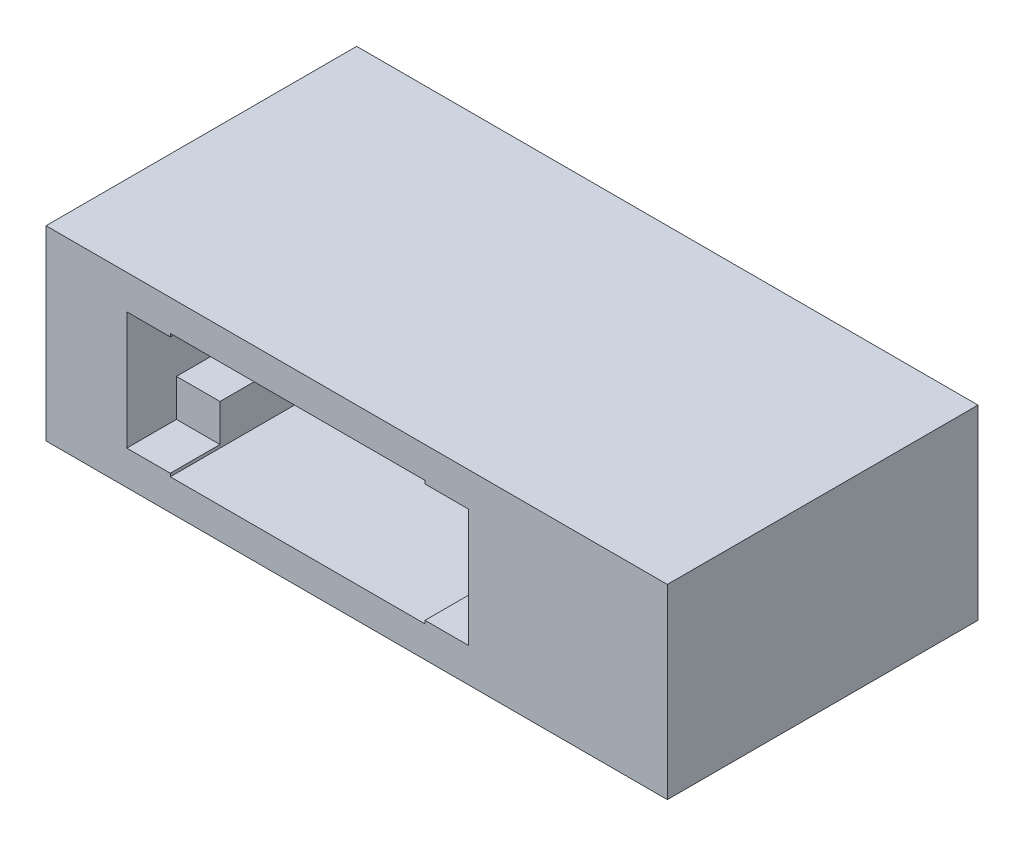
ISO-10303-21;
HEADER;
FILE_DESCRIPTION(('STEP AP214'),'2;1');
FILE_NAME('part.step','',(''),(''),'','','');
FILE_SCHEMA(('AUTOMOTIVE_DESIGN { 1 0 10303 214 1 1 1 1 }'));
ENDSEC;
DATA;
#1=APPLICATION_CONTEXT('core data for automotive mechanical design processes');
#2=APPLICATION_PROTOCOL_DEFINITION('international standard','automotive_design',2000,#1);
#3=PRODUCT_CONTEXT('',#1,'mechanical');
#4=PRODUCT('Part','Part','',(#3));
#5=PRODUCT_RELATED_PRODUCT_CATEGORY('part','',(#4));
#6=PRODUCT_DEFINITION_FORMATION('','',#4);
#7=PRODUCT_DEFINITION_CONTEXT('part definition',#1,'design');
#8=PRODUCT_DEFINITION('design','',#6,#7);
#9=PRODUCT_DEFINITION_SHAPE('','',#8);
#10=(LENGTH_UNIT() NAMED_UNIT(*) SI_UNIT(.MILLI.,.METRE.));
#11=(NAMED_UNIT(*) PLANE_ANGLE_UNIT() SI_UNIT($,.RADIAN.));
#12=(NAMED_UNIT(*) SI_UNIT($,.STERADIAN.) SOLID_ANGLE_UNIT());
#13=UNCERTAINTY_MEASURE_WITH_UNIT(LENGTH_MEASURE(1.E-05),#10,'distance_accuracy_value','');
#14=(GEOMETRIC_REPRESENTATION_CONTEXT(3) GLOBAL_UNCERTAINTY_ASSIGNED_CONTEXT((#13)) GLOBAL_UNIT_ASSIGNED_CONTEXT((#10,
#11,#12)) REPRESENTATION_CONTEXT('',''));
#15=CARTESIAN_POINT('',(0.,0.,0.));
#16=DIRECTION('',(0.,0.,1.));
#17=DIRECTION('',(1.,0.,0.));
#18=AXIS2_PLACEMENT_3D('',#15,#16,#17);
#19=CARTESIAN_POINT('',(0.,0.,13.));
#20=DIRECTION('',(0.,0.,-1.));
#21=DIRECTION('',(-1.,0.,0.));
#22=AXIS2_PLACEMENT_3D('',#19,#20,#21);
#23=PLANE('',#22);
#24=DIRECTION('',(1.,0.,0.));
#25=VECTOR('',#24,1.);
#26=CARTESIAN_POINT('',(-23.9699208264724,0.395348837209302,13.));
#27=LINE('',#26,#25);
#28=CARTESIAN_POINT('',(-16.9699208264724,0.395348837209302,13.));
#29=VERTEX_POINT('',#28);
#30=CARTESIAN_POINT('',(24.0300791735276,0.395348837209302,13.));
#31=VERTEX_POINT('',#30);
#32=EDGE_CURVE('E11',#29,#31,#27,.T.);
#33=ORIENTED_EDGE('',*,*,#32,.F.);
#34=DIRECTION('',(0.,-1.,0.));
#35=VECTOR('',#34,1.);
#36=CARTESIAN_POINT('',(-16.9699208264724,13.8953488372093,13.));
#37=LINE('',#36,#35);
#38=CARTESIAN_POINT('',(-16.9699208264724,-6.1046511627907,13.));
#39=VERTEX_POINT('',#38);
#40=EDGE_CURVE('E322',#29,#39,#37,.T.);
#41=ORIENTED_EDGE('',*,*,#40,.T.);
#42=DIRECTION('',(1.,0.,0.));
#43=VECTOR('',#42,1.);
#44=CARTESIAN_POINT('',(-16.9699208264724,-6.1046511627907,13.));
#45=LINE('',#44,#43);
#46=CARTESIAN_POINT('',(24.0300791735276,-6.1046511627907,13.));
#47=VERTEX_POINT('',#46);
#48=EDGE_CURVE('E314',#39,#47,#45,.T.);
#49=ORIENTED_EDGE('',*,*,#48,.T.);
#50=DIRECTION('',(0.,-1.,0.));
#51=VECTOR('',#50,1.);
#52=CARTESIAN_POINT('',(24.0300791735276,13.8953488372093,13.));
#53=LINE('',#52,#51);
#54=EDGE_CURVE('E317',#31,#47,#53,.T.);
#55=ORIENTED_EDGE('',*,*,#54,.F.);
#56=EDGE_LOOP('',(#33,#41,#49,#55));
#57=FACE_BOUND('',#56,.T.);
#58=ADVANCED_FACE('F38',(#57),#23,.F.);
#59=DIRECTION('',(-1.,0.,0.));
#60=VECTOR('',#59,1.);
#61=CARTESIAN_POINT('',(-23.9699208264724,7.3953488372093,13.));
#62=LINE('',#61,#60);
#63=CARTESIAN_POINT('',(24.0300791735276,7.3953488372093,13.));
#64=VERTEX_POINT('',#63);
#65=CARTESIAN_POINT('',(-16.9699208264724,7.3953488372093,13.));
#66=VERTEX_POINT('',#65);
#67=EDGE_CURVE('E219',#64,#66,#62,.T.);
#68=ORIENTED_EDGE('',*,*,#67,.F.);
#69=CARTESIAN_POINT('',(24.0300791735276,13.8953488372093,13.));
#70=VERTEX_POINT('',#69);
#71=EDGE_CURVE('E208',#70,#64,#53,.T.);
#72=ORIENTED_EDGE('',*,*,#71,.F.);
#73=DIRECTION('',(1.,0.,0.));
#74=VECTOR('',#73,1.);
#75=CARTESIAN_POINT('',(-16.9699208264724,13.8953488372093,13.));
#76=LINE('',#75,#74);
#77=CARTESIAN_POINT('',(-16.9699208264724,13.8953488372093,13.));
#78=VERTEX_POINT('',#77);
#79=EDGE_CURVE('E320',#78,#70,#76,.T.);
#80=ORIENTED_EDGE('',*,*,#79,.F.);
#81=EDGE_CURVE('E323',#78,#66,#37,.T.);
#82=ORIENTED_EDGE('',*,*,#81,.T.);
#83=EDGE_LOOP('',(#68,#72,#80,#82));
#84=FACE_BOUND('',#83,.T.);
#85=ADVANCED_FACE('F408',(#84),#23,.F.);
#86=CARTESIAN_POINT('',(-16.9699208264724,13.8953488372093,13.));
#87=DIRECTION('',(-1.,0.,0.));
#88=DIRECTION('',(0.,-1.,0.));
#89=AXIS2_PLACEMENT_3D('',#86,#87,#88);
#90=PLANE('',#89);
#91=ORIENTED_EDGE('',*,*,#40,.F.);
#92=DIRECTION('',(0.,0.,1.));
#93=VECTOR('',#92,1.);
#94=CARTESIAN_POINT('',(-16.9699208264724,0.395348837209302,13.));
#95=LINE('',#94,#93);
#96=CARTESIAN_POINT('',(-16.9699208264724,0.395348837209302,42.));
#97=VERTEX_POINT('',#96);
#98=EDGE_CURVE('E248',#29,#97,#95,.T.);
#99=ORIENTED_EDGE('',*,*,#98,.T.);
#100=DIRECTION('',(0.,1.,0.));
#101=VECTOR('',#100,1.);
#102=CARTESIAN_POINT('',(-16.9699208264724,13.3953488372093,42.));
#103=LINE('',#102,#101);
#104=CARTESIAN_POINT('',(-16.9699208264724,-5.6046511627907,42.));
#105=VERTEX_POINT('',#104);
#106=EDGE_CURVE('E286',#105,#97,#103,.T.);
#107=ORIENTED_EDGE('',*,*,#106,.F.);
#108=DIRECTION('',(0.,0.,1.));
#109=VECTOR('',#108,1.);
#110=CARTESIAN_POINT('',(-16.9699208264724,-5.6046511627907,42.));
#111=LINE('',#110,#109);
#112=CARTESIAN_POINT('',(-16.9699208264724,-5.6046511627907,50.));
#113=VERTEX_POINT('',#112);
#114=EDGE_CURVE('E274',#105,#113,#111,.T.);
#115=ORIENTED_EDGE('',*,*,#114,.T.);
#116=DIRECTION('',(0.,-1.,0.));
#117=VECTOR('',#116,1.);
#118=CARTESIAN_POINT('',(-16.9699208264724,13.8953488372093,50.));
#119=LINE('',#118,#117);
#120=CARTESIAN_POINT('',(-16.9699208264724,-6.1046511627907,50.));
#121=VERTEX_POINT('',#120);
#122=EDGE_CURVE('E336',#113,#121,#119,.T.);
#123=ORIENTED_EDGE('',*,*,#122,.T.);
#124=DIRECTION('',(0.,0.,1.));
#125=VECTOR('',#124,1.);
#126=CARTESIAN_POINT('',(-16.9699208264724,-6.1046511627907,13.));
#127=LINE('',#126,#125);
#128=EDGE_CURVE('E339',#39,#121,#127,.T.);
#129=ORIENTED_EDGE('',*,*,#128,.F.);
#130=EDGE_LOOP('',(#91,#99,#107,#115,#123,#129));
#131=FACE_BOUND('',#130,.T.);
#132=ADVANCED_FACE('F415',(#131),#90,.F.);
#133=CARTESIAN_POINT('',(0.,0.,42.));
#134=DIRECTION('',(0.,0.,-1.));
#135=DIRECTION('',(-1.,0.,0.));
#136=AXIS2_PLACEMENT_3D('',#133,#134,#135);
#137=PLANE('',#136);
#138=ORIENTED_EDGE('',*,*,#106,.T.);
#139=DIRECTION('',(1.,0.,0.));
#140=VECTOR('',#139,1.);
#141=CARTESIAN_POINT('',(-16.9699208264724,0.395348837209302,42.));
#142=LINE('',#141,#140);
#143=CARTESIAN_POINT('',(-23.9699208264724,0.395348837209302,42.));
#144=VERTEX_POINT('',#143);
#145=EDGE_CURVE('E245',#144,#97,#142,.T.);
#146=ORIENTED_EDGE('',*,*,#145,.F.);
#147=DIRECTION('',(0.,-1.,0.));
#148=VECTOR('',#147,1.);
#149=CARTESIAN_POINT('',(-23.9699208264724,13.3953488372093,42.));
#150=LINE('',#149,#148);
#151=CARTESIAN_POINT('',(-23.9699208264724,-5.6046511627907,42.));
#152=VERTEX_POINT('',#151);
#153=EDGE_CURVE('E293',#144,#152,#150,.T.);
#154=ORIENTED_EDGE('',*,*,#153,.T.);
#155=DIRECTION('',(1.,0.,0.));
#156=VECTOR('',#155,1.);
#157=CARTESIAN_POINT('',(-16.9699208264724,-5.6046511627907,42.));
#158=LINE('',#157,#156);
#159=EDGE_CURVE('E297',#152,#105,#158,.T.);
#160=ORIENTED_EDGE('',*,*,#159,.T.);
#161=EDGE_LOOP('',(#138,#146,#154,#160));
#162=FACE_BOUND('',#161,.T.);
#163=ADVANCED_FACE('F504',(#162),#137,.F.);
#164=CARTESIAN_POINT('',(-36.9699208264724,-11.1046511627907,50.));
#165=DIRECTION('',(0.,1.,0.));
#166=DIRECTION('',(0.,0.,1.));
#167=AXIS2_PLACEMENT_3D('',#164,#165,#166);
#168=PLANE('',#167);
#169=DIRECTION('',(1.,0.,0.));
#170=VECTOR('',#169,1.);
#171=CARTESIAN_POINT('',(-36.9699208264724,-11.1046511627907,0.));
#172=LINE('',#171,#170);
#173=CARTESIAN_POINT('',(-36.9699208264724,-11.1046511627907,0.));
#174=VERTEX_POINT('',#173);
#175=CARTESIAN_POINT('',(63.0300791735277,-11.1046511627907,0.));
#176=VERTEX_POINT('',#175);
#177=EDGE_CURVE('E342',#174,#176,#172,.T.);
#178=ORIENTED_EDGE('',*,*,#177,.T.);
#179=DIRECTION('',(0.,0.,-1.));
#180=VECTOR('',#179,1.);
#181=CARTESIAN_POINT('',(63.0300791735277,-11.1046511627907,50.));
#182=LINE('',#181,#180);
#183=CARTESIAN_POINT('',(63.0300791735277,-11.1046511627907,50.));
#184=VERTEX_POINT('',#183);
#185=EDGE_CURVE('E42',#184,#176,#182,.T.);
#186=ORIENTED_EDGE('',*,*,#185,.F.);
#187=DIRECTION('',(1.,0.,0.));
#188=VECTOR('',#187,1.);
#189=CARTESIAN_POINT('',(-36.9699208264724,-11.1046511627907,50.));
#190=LINE('',#189,#188);
#191=CARTESIAN_POINT('',(-36.9699208264724,-11.1046511627907,50.));
#192=VERTEX_POINT('',#191);
#193=EDGE_CURVE('E349',#192,#184,#190,.T.);
#194=ORIENTED_EDGE('',*,*,#193,.F.);
#195=DIRECTION('',(0.,0.,-1.));
#196=VECTOR('',#195,1.);
#197=CARTESIAN_POINT('',(-36.9699208264724,-11.1046511627907,50.));
#198=LINE('',#197,#196);
#199=EDGE_CURVE('E360',#192,#174,#198,.T.);
#200=ORIENTED_EDGE('',*,*,#199,.T.);
#201=EDGE_LOOP('',(#178,#186,#194,#200));
#202=FACE_BOUND('',#201,.T.);
#203=ADVANCED_FACE('F40',(#202),#168,.F.);
#204=CARTESIAN_POINT('',(63.0300791735276,18.8953488372093,50.));
#205=DIRECTION('',(1.,0.,0.));
#206=DIRECTION('',(0.,1.,0.));
#207=AXIS2_PLACEMENT_3D('',#204,#205,#206);
#208=PLANE('',#207);
#209=DIRECTION('',(0.,-1.,0.));
#210=VECTOR('',#209,1.);
#211=CARTESIAN_POINT('',(63.0300791735276,18.8953488372093,0.));
#212=LINE('',#211,#210);
#213=CARTESIAN_POINT('',(63.0300791735276,18.8953488372093,0.));
#214=VERTEX_POINT('',#213);
#215=EDGE_CURVE('E363',#214,#176,#212,.T.);
#216=ORIENTED_EDGE('',*,*,#215,.F.);
#217=DIRECTION('',(0.,0.,-1.));
#218=VECTOR('',#217,1.);
#219=CARTESIAN_POINT('',(63.0300791735276,18.8953488372093,50.));
#220=LINE('',#219,#218);
#221=CARTESIAN_POINT('',(63.0300791735276,18.8953488372093,50.));
#222=VERTEX_POINT('',#221);
#223=EDGE_CURVE('E373',#222,#214,#220,.T.);
#224=ORIENTED_EDGE('',*,*,#223,.F.);
#225=DIRECTION('',(0.,-1.,0.));
#226=VECTOR('',#225,1.);
#227=CARTESIAN_POINT('',(63.0300791735276,18.8953488372093,50.));
#228=LINE('',#227,#226);
#229=EDGE_CURVE('E351',#222,#184,#228,.T.);
#230=ORIENTED_EDGE('',*,*,#229,.T.);
#231=ORIENTED_EDGE('',*,*,#185,.T.);
#232=EDGE_LOOP('',(#216,#224,#230,#231));
#233=FACE_BOUND('',#232,.T.);
#234=ADVANCED_FACE('F379',(#233),#208,.T.);
#235=CARTESIAN_POINT('',(-36.9699208264724,18.8953488372093,50.));
#236=DIRECTION('',(0.,1.,0.));
#237=DIRECTION('',(0.,0.,1.));
#238=AXIS2_PLACEMENT_3D('',#235,#236,#237);
#239=PLANE('',#238);
#240=DIRECTION('',(1.,0.,0.));
#241=VECTOR('',#240,1.);
#242=CARTESIAN_POINT('',(-36.9699208264724,18.8953488372093,0.));
#243=LINE('',#242,#241);
#244=CARTESIAN_POINT('',(-36.9699208264724,18.8953488372093,0.));
#245=VERTEX_POINT('',#244);
#246=EDGE_CURVE('E366',#245,#214,#243,.T.);
#247=ORIENTED_EDGE('',*,*,#246,.F.);
#248=DIRECTION('',(0.,0.,-1.));
#249=VECTOR('',#248,1.);
#250=CARTESIAN_POINT('',(-36.9699208264724,18.8953488372093,50.));
#251=LINE('',#250,#249);
#252=CARTESIAN_POINT('',(-36.9699208264724,18.8953488372093,50.));
#253=VERTEX_POINT('',#252);
#254=EDGE_CURVE('E372',#253,#245,#251,.T.);
#255=ORIENTED_EDGE('',*,*,#254,.F.);
#256=DIRECTION('',(1.,0.,0.));
#257=VECTOR('',#256,1.);
#258=CARTESIAN_POINT('',(-36.9699208264724,18.8953488372093,50.));
#259=LINE('',#258,#257);
#260=EDGE_CURVE('E355',#253,#222,#259,.T.);
#261=ORIENTED_EDGE('',*,*,#260,.T.);
#262=ORIENTED_EDGE('',*,*,#223,.T.);
#263=EDGE_LOOP('',(#247,#255,#261,#262));
#264=FACE_BOUND('',#263,.T.);
#265=ADVANCED_FACE('F386',(#264),#239,.T.);
#266=CARTESIAN_POINT('',(-36.9699208264724,18.8953488372093,50.));
#267=DIRECTION('',(1.,0.,0.));
#268=DIRECTION('',(0.,0.,-1.));
#269=AXIS2_PLACEMENT_3D('',#266,#267,#268);
#270=PLANE('',#269);
#271=DIRECTION('',(0.,-1.,0.));
#272=VECTOR('',#271,1.);
#273=CARTESIAN_POINT('',(-36.9699208264724,18.8953488372093,0.));
#274=LINE('',#273,#272);
#275=EDGE_CURVE('E352',#245,#174,#274,.T.);
#276=ORIENTED_EDGE('',*,*,#275,.T.);
#277=ORIENTED_EDGE('',*,*,#199,.F.);
#278=DIRECTION('',(0.,-1.,0.));
#279=VECTOR('',#278,1.);
#280=CARTESIAN_POINT('',(-36.9699208264724,18.8953488372093,50.));
#281=LINE('',#280,#279);
#282=EDGE_CURVE('E358',#253,#192,#281,.T.);
#283=ORIENTED_EDGE('',*,*,#282,.F.);
#284=ORIENTED_EDGE('',*,*,#254,.T.);
#285=EDGE_LOOP('',(#276,#277,#283,#284));
#286=FACE_BOUND('',#285,.T.);
#287=ADVANCED_FACE('F390',(#286),#270,.F.);
#288=CARTESIAN_POINT('',(0.,0.,50.));
#289=DIRECTION('',(0.,0.,-1.));
#290=DIRECTION('',(-1.,0.,0.));
#291=AXIS2_PLACEMENT_3D('',#288,#289,#290);
#292=PLANE('',#291);
#293=DIRECTION('',(0.,-1.,0.));
#294=VECTOR('',#293,1.);
#295=CARTESIAN_POINT('',(24.0300791735276,13.8953488372093,50.));
#296=LINE('',#295,#294);
#297=CARTESIAN_POINT('',(24.0300791735276,13.8953488372093,50.));
#298=VERTEX_POINT('',#297);
#299=CARTESIAN_POINT('',(24.0300791735276,13.3953488372093,50.));
#300=VERTEX_POINT('',#299);
#301=EDGE_CURVE('E330',#298,#300,#296,.T.);
#302=ORIENTED_EDGE('',*,*,#301,.T.);
#303=DIRECTION('',(-1.,0.,0.));
#304=VECTOR('',#303,1.);
#305=CARTESIAN_POINT('',(24.0300791735276,13.3953488372093,50.));
#306=LINE('',#305,#304);
#307=CARTESIAN_POINT('',(31.0300791735276,13.3953488372093,50.));
#308=VERTEX_POINT('',#307);
#309=EDGE_CURVE('E261',#308,#300,#306,.T.);
#310=ORIENTED_EDGE('',*,*,#309,.F.);
#311=DIRECTION('',(0.,1.,0.));
#312=VECTOR('',#311,1.);
#313=CARTESIAN_POINT('',(31.0300791735276,13.3953488372093,50.));
#314=LINE('',#313,#312);
#315=CARTESIAN_POINT('',(31.0300791735276,-5.6046511627907,50.));
#316=VERTEX_POINT('',#315);
#317=EDGE_CURVE('E273',#316,#308,#314,.T.);
#318=ORIENTED_EDGE('',*,*,#317,.F.);
#319=DIRECTION('',(1.,0.,0.));
#320=VECTOR('',#319,1.);
#321=CARTESIAN_POINT('',(24.0300791735276,-5.6046511627907,50.));
#322=LINE('',#321,#320);
#323=CARTESIAN_POINT('',(24.0300791735276,-5.6046511627907,50.));
#324=VERTEX_POINT('',#323);
#325=EDGE_CURVE('E270',#324,#316,#322,.T.);
#326=ORIENTED_EDGE('',*,*,#325,.F.);
#327=CARTESIAN_POINT('',(24.0300791735276,-6.1046511627907,50.));
#328=VERTEX_POINT('',#327);
#329=EDGE_CURVE('E329',#324,#328,#296,.T.);
#330=ORIENTED_EDGE('',*,*,#329,.T.);
#331=DIRECTION('',(1.,0.,0.));
#332=VECTOR('',#331,1.);
#333=CARTESIAN_POINT('',(-16.9699208264724,-6.1046511627907,50.));
#334=LINE('',#333,#332);
#335=EDGE_CURVE('E280',#121,#328,#334,.T.);
#336=ORIENTED_EDGE('',*,*,#335,.F.);
#337=ORIENTED_EDGE('',*,*,#122,.F.);
#338=DIRECTION('',(1.,0.,0.));
#339=VECTOR('',#338,1.);
#340=CARTESIAN_POINT('',(-16.9699208264724,-5.6046511627907,50.));
#341=LINE('',#340,#339);
#342=CARTESIAN_POINT('',(-23.9699208264724,-5.6046511627907,50.));
#343=VERTEX_POINT('',#342);
#344=EDGE_CURVE('E305',#343,#113,#341,.T.);
#345=ORIENTED_EDGE('',*,*,#344,.F.);
#346=DIRECTION('',(0.,-1.,0.));
#347=VECTOR('',#346,1.);
#348=CARTESIAN_POINT('',(-23.9699208264724,13.3953488372093,50.));
#349=LINE('',#348,#347);
#350=CARTESIAN_POINT('',(-23.9699208264724,13.3953488372093,50.));
#351=VERTEX_POINT('',#350);
#352=EDGE_CURVE('E302',#351,#343,#349,.T.);
#353=ORIENTED_EDGE('',*,*,#352,.F.);
#354=DIRECTION('',(-1.,0.,0.));
#355=VECTOR('',#354,1.);
#356=CARTESIAN_POINT('',(-16.9699208264724,13.3953488372093,50.));
#357=LINE('',#356,#355);
#358=CARTESIAN_POINT('',(-16.9699208264724,13.3953488372093,50.));
#359=VERTEX_POINT('',#358);
#360=EDGE_CURVE('E251',#359,#351,#357,.T.);
#361=ORIENTED_EDGE('',*,*,#360,.F.);
#362=CARTESIAN_POINT('',(-16.9699208264724,13.8953488372093,50.));
#363=VERTEX_POINT('',#362);
#364=EDGE_CURVE('E318',#363,#359,#119,.T.);
#365=ORIENTED_EDGE('',*,*,#364,.F.);
#366=DIRECTION('',(1.,0.,0.));
#367=VECTOR('',#366,1.);
#368=CARTESIAN_POINT('',(-16.9699208264724,13.8953488372093,50.));
#369=LINE('',#368,#367);
#370=EDGE_CURVE('E333',#363,#298,#369,.T.);
#371=ORIENTED_EDGE('',*,*,#370,.T.);
#372=EDGE_LOOP('',(#302,#310,#318,#326,#330,#336,#337,#345,#353,#361,#365,#371));
#373=FACE_BOUND('',#372,.T.);
#374=ORIENTED_EDGE('',*,*,#193,.T.);
#375=ORIENTED_EDGE('',*,*,#229,.F.);
#376=ORIENTED_EDGE('',*,*,#260,.F.);
#377=ORIENTED_EDGE('',*,*,#282,.T.);
#378=EDGE_LOOP('',(#374,#375,#376,#377));
#379=FACE_BOUND('',#378,.T.);
#380=ADVANCED_FACE('F392',(#373,#379),#292,.F.);
#381=CARTESIAN_POINT('',(0.,0.,0.));
#382=DIRECTION('',(0.,0.,-1.));
#383=DIRECTION('',(-1.,0.,0.));
#384=AXIS2_PLACEMENT_3D('',#381,#382,#383);
#385=PLANE('',#384);
#386=CARTESIAN_POINT('',(-7.96992082647236,3.8953488372093,0.));
#387=DIRECTION('',(0.,0.,-1.));
#388=DIRECTION('',(-1.,0.,0.));
#389=AXIS2_PLACEMENT_3D('',#386,#387,#388);
#390=CIRCLE('',#389,2.5);
#391=CARTESIAN_POINT('',(-10.4699208264724,3.8953488372093,0.));
#392=VERTEX_POINT('',#391);
#393=EDGE_CURVE('E595',#392,#392,#390,.T.);
#394=ORIENTED_EDGE('',*,*,#393,.F.);
#395=EDGE_LOOP('',(#394));
#396=FACE_BOUND('',#395,.T.);
#397=DIRECTION('',(0.,1.,0.));
#398=VECTOR('',#397,1.);
#399=CARTESIAN_POINT('',(24.0300791735276,7.3953488372093,0.));
#400=LINE('',#399,#398);
#401=CARTESIAN_POINT('',(24.0300791735276,0.395348837209302,0.));
#402=VERTEX_POINT('',#401);
#403=CARTESIAN_POINT('',(24.0300791735276,7.3953488372093,0.));
#404=VERTEX_POINT('',#403);
#405=EDGE_CURVE('E204',#402,#404,#400,.T.);
#406=ORIENTED_EDGE('',*,*,#405,.T.);
#407=DIRECTION('',(-1.,0.,0.));
#408=VECTOR('',#407,1.);
#409=CARTESIAN_POINT('',(24.0300791735276,7.3953488372093,0.));
#410=LINE('',#409,#408);
#411=CARTESIAN_POINT('',(19.0300791735276,7.3953488372093,0.));
#412=VERTEX_POINT('',#411);
#413=EDGE_CURVE('E214',#404,#412,#410,.T.);
#414=ORIENTED_EDGE('',*,*,#413,.T.);
#415=DIRECTION('',(0.,-1.,0.));
#416=VECTOR('',#415,1.);
#417=CARTESIAN_POINT('',(19.0300791735276,7.3953488372093,0.));
#418=LINE('',#417,#416);
#419=CARTESIAN_POINT('',(19.0300791735276,0.395348837209302,0.));
#420=VERTEX_POINT('',#419);
#421=EDGE_CURVE('E228',#412,#420,#418,.T.);
#422=ORIENTED_EDGE('',*,*,#421,.T.);
#423=DIRECTION('',(1.,0.,0.));
#424=VECTOR('',#423,1.);
#425=CARTESIAN_POINT('',(24.0300791735276,0.395348837209302,0.));
#426=LINE('',#425,#424);
#427=EDGE_CURVE('E224',#420,#402,#426,.T.);
#428=ORIENTED_EDGE('',*,*,#427,.T.);
#429=EDGE_LOOP('',(#406,#414,#422,#428));
#430=FACE_BOUND('',#429,.T.);
#431=ORIENTED_EDGE('',*,*,#177,.F.);
#432=ORIENTED_EDGE('',*,*,#275,.F.);
#433=ORIENTED_EDGE('',*,*,#246,.T.);
#434=ORIENTED_EDGE('',*,*,#215,.T.);
#435=EDGE_LOOP('',(#431,#432,#433,#434));
#436=FACE_BOUND('',#435,.T.);
#437=ADVANCED_FACE('F222',(#396,#430,#436),#385,.T.);
#438=CARTESIAN_POINT('',(-16.9699208264724,-6.1046511627907,13.));
#439=DIRECTION('',(0.,-1.,0.));
#440=DIRECTION('',(1.,0.,0.));
#441=AXIS2_PLACEMENT_3D('',#438,#439,#440);
#442=PLANE('',#441);
#443=ORIENTED_EDGE('',*,*,#335,.T.);
#444=DIRECTION('',(0.,0.,1.));
#445=VECTOR('',#444,1.);
#446=CARTESIAN_POINT('',(24.0300791735276,-6.1046511627907,13.));
#447=LINE('',#446,#445);
#448=EDGE_CURVE('E326',#47,#328,#447,.T.);
#449=ORIENTED_EDGE('',*,*,#448,.F.);
#450=ORIENTED_EDGE('',*,*,#48,.F.);
#451=ORIENTED_EDGE('',*,*,#128,.T.);
#452=EDGE_LOOP('',(#443,#449,#450,#451));
#453=FACE_BOUND('',#452,.T.);
#454=ADVANCED_FACE('F401',(#453),#442,.F.);
#455=CARTESIAN_POINT('',(-16.9699208264724,7.3953488372093,42.));
#456=VERTEX_POINT('',#455);
#457=CARTESIAN_POINT('',(-16.9699208264724,13.3953488372093,42.));
#458=VERTEX_POINT('',#457);
#459=EDGE_CURVE('E290',#456,#458,#103,.T.);
#460=ORIENTED_EDGE('',*,*,#459,.F.);
#461=DIRECTION('',(0.,0.,1.));
#462=VECTOR('',#461,1.);
#463=CARTESIAN_POINT('',(-16.9699208264724,7.3953488372093,13.));
#464=LINE('',#463,#462);
#465=EDGE_CURVE('E247',#66,#456,#464,.T.);
#466=ORIENTED_EDGE('',*,*,#465,.F.);
#467=ORIENTED_EDGE('',*,*,#81,.F.);
#468=DIRECTION('',(0.,0.,1.));
#469=VECTOR('',#468,1.);
#470=CARTESIAN_POINT('',(-16.9699208264724,13.8953488372093,13.));
#471=LINE('',#470,#469);
#472=EDGE_CURVE('E343',#78,#363,#471,.T.);
#473=ORIENTED_EDGE('',*,*,#472,.T.);
#474=ORIENTED_EDGE('',*,*,#364,.T.);
#475=DIRECTION('',(0.,0.,1.));
#476=VECTOR('',#475,1.);
#477=CARTESIAN_POINT('',(-16.9699208264724,13.3953488372093,42.));
#478=LINE('',#477,#476);
#479=EDGE_CURVE('E299',#458,#359,#478,.T.);
#480=ORIENTED_EDGE('',*,*,#479,.F.);
#481=EDGE_LOOP('',(#460,#466,#467,#473,#474,#480));
#482=FACE_BOUND('',#481,.T.);
#483=ADVANCED_FACE('F421',(#482),#90,.F.);
#484=CARTESIAN_POINT('',(-16.9699208264724,13.8953488372093,13.));
#485=DIRECTION('',(0.,-1.,0.));
#486=DIRECTION('',(1.,0.,0.));
#487=AXIS2_PLACEMENT_3D('',#484,#485,#486);
#488=PLANE('',#487);
#489=ORIENTED_EDGE('',*,*,#370,.F.);
#490=ORIENTED_EDGE('',*,*,#472,.F.);
#491=ORIENTED_EDGE('',*,*,#79,.T.);
#492=DIRECTION('',(0.,0.,1.));
#493=VECTOR('',#492,1.);
#494=CARTESIAN_POINT('',(24.0300791735276,13.8953488372093,13.));
#495=LINE('',#494,#493);
#496=EDGE_CURVE('E345',#70,#298,#495,.T.);
#497=ORIENTED_EDGE('',*,*,#496,.T.);
#498=EDGE_LOOP('',(#489,#490,#491,#497));
#499=FACE_BOUND('',#498,.T.);
#500=ADVANCED_FACE('F424',(#499),#488,.T.);
#501=CARTESIAN_POINT('',(24.0300791735276,13.8953488372093,13.));
#502=DIRECTION('',(-1.,0.,0.));
#503=DIRECTION('',(0.,0.,1.));
#504=AXIS2_PLACEMENT_3D('',#501,#502,#503);
#505=PLANE('',#504);
#506=DIRECTION('',(0.,0.,1.));
#507=VECTOR('',#506,1.);
#508=CARTESIAN_POINT('',(24.0300791735276,13.3953488372093,42.));
#509=LINE('',#508,#507);
#510=CARTESIAN_POINT('',(24.0300791735276,13.3953488372093,42.));
#511=VERTEX_POINT('',#510);
#512=EDGE_CURVE('E278',#511,#300,#509,.T.);
#513=ORIENTED_EDGE('',*,*,#512,.T.);
#514=ORIENTED_EDGE('',*,*,#301,.F.);
#515=ORIENTED_EDGE('',*,*,#496,.F.);
#516=ORIENTED_EDGE('',*,*,#71,.T.);
#517=DIRECTION('',(0.,0.,1.));
#518=VECTOR('',#517,1.);
#519=CARTESIAN_POINT('',(24.0300791735276,7.3953488372093,8.));
#520=LINE('',#519,#518);
#521=EDGE_CURVE('E199',#404,#64,#520,.T.);
#522=ORIENTED_EDGE('',*,*,#521,.F.);
#523=ORIENTED_EDGE('',*,*,#405,.F.);
#524=DIRECTION('',(0.,0.,1.));
#525=VECTOR('',#524,1.);
#526=CARTESIAN_POINT('',(24.0300791735276,0.395348837209302,8.));
#527=LINE('',#526,#525);
#528=EDGE_CURVE('E211',#402,#31,#527,.T.);
#529=ORIENTED_EDGE('',*,*,#528,.T.);
#530=ORIENTED_EDGE('',*,*,#54,.T.);
#531=ORIENTED_EDGE('',*,*,#448,.T.);
#532=ORIENTED_EDGE('',*,*,#329,.F.);
#533=DIRECTION('',(0.,0.,1.));
#534=VECTOR('',#533,1.);
#535=CARTESIAN_POINT('',(24.0300791735276,-5.6046511627907,42.));
#536=LINE('',#535,#534);
#537=CARTESIAN_POINT('',(24.0300791735276,-5.6046511627907,42.));
#538=VERTEX_POINT('',#537);
#539=EDGE_CURVE('E269',#538,#324,#536,.T.);
#540=ORIENTED_EDGE('',*,*,#539,.F.);
#541=DIRECTION('',(0.,-1.,0.));
#542=VECTOR('',#541,1.);
#543=CARTESIAN_POINT('',(24.0300791735276,13.3953488372093,42.));
#544=LINE('',#543,#542);
#545=EDGE_CURVE('E257',#511,#538,#544,.T.);
#546=ORIENTED_EDGE('',*,*,#545,.F.);
#547=EDGE_LOOP('',(#513,#514,#515,#516,#522,#523,#529,#530,#531,#532,#540,#546));
#548=FACE_BOUND('',#547,.T.);
#549=ADVANCED_FACE('F201',(#548),#505,.T.);
#550=CARTESIAN_POINT('',(24.0300791735276,13.3953488372093,42.));
#551=DIRECTION('',(0.,1.,0.));
#552=DIRECTION('',(-1.,0.,0.));
#553=AXIS2_PLACEMENT_3D('',#550,#551,#552);
#554=PLANE('',#553);
#555=ORIENTED_EDGE('',*,*,#309,.T.);
#556=ORIENTED_EDGE('',*,*,#512,.F.);
#557=DIRECTION('',(-1.,0.,0.));
#558=VECTOR('',#557,1.);
#559=CARTESIAN_POINT('',(24.0300791735276,13.3953488372093,42.));
#560=LINE('',#559,#558);
#561=CARTESIAN_POINT('',(31.0300791735276,13.3953488372093,42.));
#562=VERTEX_POINT('',#561);
#563=EDGE_CURVE('E267',#562,#511,#560,.T.);
#564=ORIENTED_EDGE('',*,*,#563,.F.);
#565=DIRECTION('',(0.,0.,1.));
#566=VECTOR('',#565,1.);
#567=CARTESIAN_POINT('',(31.0300791735276,13.3953488372093,42.));
#568=LINE('',#567,#566);
#569=EDGE_CURVE('E281',#562,#308,#568,.T.);
#570=ORIENTED_EDGE('',*,*,#569,.T.);
#571=EDGE_LOOP('',(#555,#556,#564,#570));
#572=FACE_BOUND('',#571,.T.);
#573=ADVANCED_FACE('F430',(#572),#554,.F.);
#574=CARTESIAN_POINT('',(31.0300791735276,13.3953488372093,42.));
#575=DIRECTION('',(1.,0.,0.));
#576=DIRECTION('',(0.,1.,0.));
#577=AXIS2_PLACEMENT_3D('',#574,#575,#576);
#578=PLANE('',#577);
#579=ORIENTED_EDGE('',*,*,#317,.T.);
#580=ORIENTED_EDGE('',*,*,#569,.F.);
#581=DIRECTION('',(0.,1.,0.));
#582=VECTOR('',#581,1.);
#583=CARTESIAN_POINT('',(31.0300791735276,13.3953488372093,42.));
#584=LINE('',#583,#582);
#585=CARTESIAN_POINT('',(31.0300791735276,-5.6046511627907,42.));
#586=VERTEX_POINT('',#585);
#587=EDGE_CURVE('E264',#586,#562,#584,.T.);
#588=ORIENTED_EDGE('',*,*,#587,.F.);
#589=DIRECTION('',(0.,0.,1.));
#590=VECTOR('',#589,1.);
#591=CARTESIAN_POINT('',(31.0300791735276,-5.6046511627907,42.));
#592=LINE('',#591,#590);
#593=EDGE_CURVE('E283',#586,#316,#592,.T.);
#594=ORIENTED_EDGE('',*,*,#593,.T.);
#595=EDGE_LOOP('',(#579,#580,#588,#594));
#596=FACE_BOUND('',#595,.T.);
#597=ADVANCED_FACE('F479',(#596),#578,.F.);
#598=CARTESIAN_POINT('',(24.0300791735276,-5.6046511627907,42.));
#599=DIRECTION('',(0.,-1.,0.));
#600=DIRECTION('',(1.,0.,0.));
#601=AXIS2_PLACEMENT_3D('',#598,#599,#600);
#602=PLANE('',#601);
#603=ORIENTED_EDGE('',*,*,#325,.T.);
#604=ORIENTED_EDGE('',*,*,#593,.F.);
#605=DIRECTION('',(1.,0.,0.));
#606=VECTOR('',#605,1.);
#607=CARTESIAN_POINT('',(24.0300791735276,-5.6046511627907,42.));
#608=LINE('',#607,#606);
#609=EDGE_CURVE('E260',#538,#586,#608,.T.);
#610=ORIENTED_EDGE('',*,*,#609,.F.);
#611=ORIENTED_EDGE('',*,*,#539,.T.);
#612=EDGE_LOOP('',(#603,#604,#610,#611));
#613=FACE_BOUND('',#612,.T.);
#614=ADVANCED_FACE('F482',(#613),#602,.F.);
#615=CARTESIAN_POINT('',(0.,0.,42.));
#616=DIRECTION('',(0.,0.,1.));
#617=DIRECTION('',(1.,0.,0.));
#618=AXIS2_PLACEMENT_3D('',#615,#616,#617);
#619=PLANE('',#618);
#620=ORIENTED_EDGE('',*,*,#545,.T.);
#621=ORIENTED_EDGE('',*,*,#609,.T.);
#622=ORIENTED_EDGE('',*,*,#587,.T.);
#623=ORIENTED_EDGE('',*,*,#563,.T.);
#624=EDGE_LOOP('',(#620,#621,#622,#623));
#625=FACE_BOUND('',#624,.T.);
#626=ADVANCED_FACE('F484',(#625),#619,.T.);
#627=CARTESIAN_POINT('',(-16.9699208264724,-5.6046511627907,42.));
#628=DIRECTION('',(0.,-1.,0.));
#629=DIRECTION('',(1.,0.,0.));
#630=AXIS2_PLACEMENT_3D('',#627,#628,#629);
#631=PLANE('',#630);
#632=ORIENTED_EDGE('',*,*,#344,.T.);
#633=ORIENTED_EDGE('',*,*,#114,.F.);
#634=ORIENTED_EDGE('',*,*,#159,.F.);
#635=DIRECTION('',(0.,0.,1.));
#636=VECTOR('',#635,1.);
#637=CARTESIAN_POINT('',(-23.9699208264724,-5.6046511627907,42.));
#638=LINE('',#637,#636);
#639=EDGE_CURVE('E309',#152,#343,#638,.T.);
#640=ORIENTED_EDGE('',*,*,#639,.T.);
#641=EDGE_LOOP('',(#632,#633,#634,#640));
#642=FACE_BOUND('',#641,.T.);
#643=ADVANCED_FACE('F454',(#642),#631,.F.);
#644=CARTESIAN_POINT('',(-23.9699208264724,13.3953488372093,42.));
#645=DIRECTION('',(-1.,0.,0.));
#646=DIRECTION('',(0.,-1.,0.));
#647=AXIS2_PLACEMENT_3D('',#644,#645,#646);
#648=PLANE('',#647);
#649=ORIENTED_EDGE('',*,*,#352,.T.);
#650=ORIENTED_EDGE('',*,*,#639,.F.);
#651=ORIENTED_EDGE('',*,*,#153,.F.);
#652=DIRECTION('',(0.,0.,1.));
#653=VECTOR('',#652,1.);
#654=CARTESIAN_POINT('',(-23.9699208264724,0.395348837209302,13.));
#655=LINE('',#654,#653);
#656=CARTESIAN_POINT('',(-23.9699208264724,0.395348837209302,8.));
#657=VERTEX_POINT('',#656);
#658=EDGE_CURVE('E252',#657,#144,#655,.T.);
#659=ORIENTED_EDGE('',*,*,#658,.F.);
#660=DIRECTION('',(0.,-1.,0.));
#661=VECTOR('',#660,1.);
#662=CARTESIAN_POINT('',(-23.9699208264724,7.3953488372093,8.));
#663=LINE('',#662,#661);
#664=CARTESIAN_POINT('',(-23.9699208264724,7.3953488372093,8.));
#665=VERTEX_POINT('',#664);
#666=EDGE_CURVE('E234',#665,#657,#663,.T.);
#667=ORIENTED_EDGE('',*,*,#666,.F.);
#668=DIRECTION('',(0.,0.,1.));
#669=VECTOR('',#668,1.);
#670=CARTESIAN_POINT('',(-23.9699208264724,7.3953488372093,13.));
#671=LINE('',#670,#669);
#672=CARTESIAN_POINT('',(-23.9699208264724,7.3953488372093,42.));
#673=VERTEX_POINT('',#672);
#674=EDGE_CURVE('E254',#665,#673,#671,.T.);
#675=ORIENTED_EDGE('',*,*,#674,.T.);
#676=CARTESIAN_POINT('',(-23.9699208264724,13.3953488372093,42.));
#677=VERTEX_POINT('',#676);
#678=EDGE_CURVE('E294',#677,#673,#150,.T.);
#679=ORIENTED_EDGE('',*,*,#678,.F.);
#680=DIRECTION('',(0.,0.,1.));
#681=VECTOR('',#680,1.);
#682=CARTESIAN_POINT('',(-23.9699208264724,13.3953488372093,42.));
#683=LINE('',#682,#681);
#684=EDGE_CURVE('E311',#677,#351,#683,.T.);
#685=ORIENTED_EDGE('',*,*,#684,.T.);
#686=EDGE_LOOP('',(#649,#650,#651,#659,#667,#675,#679,#685));
#687=FACE_BOUND('',#686,.T.);
#688=ADVANCED_FACE('F459',(#687),#648,.F.);
#689=CARTESIAN_POINT('',(-16.9699208264724,13.3953488372093,42.));
#690=DIRECTION('',(0.,1.,0.));
#691=DIRECTION('',(0.,0.,1.));
#692=AXIS2_PLACEMENT_3D('',#689,#690,#691);
#693=PLANE('',#692);
#694=ORIENTED_EDGE('',*,*,#360,.T.);
#695=ORIENTED_EDGE('',*,*,#684,.F.);
#696=DIRECTION('',(-1.,0.,0.));
#697=VECTOR('',#696,1.);
#698=CARTESIAN_POINT('',(-16.9699208264724,13.3953488372093,42.));
#699=LINE('',#698,#697);
#700=EDGE_CURVE('E289',#458,#677,#699,.T.);
#701=ORIENTED_EDGE('',*,*,#700,.F.);
#702=ORIENTED_EDGE('',*,*,#479,.T.);
#703=EDGE_LOOP('',(#694,#695,#701,#702));
#704=FACE_BOUND('',#703,.T.);
#705=ADVANCED_FACE('F419',(#704),#693,.F.);
#706=ORIENTED_EDGE('',*,*,#678,.T.);
#707=DIRECTION('',(-1.,0.,0.));
#708=VECTOR('',#707,1.);
#709=CARTESIAN_POINT('',(-16.9699208264724,7.3953488372093,42.));
#710=LINE('',#709,#708);
#711=EDGE_CURVE('E210',#456,#673,#710,.T.);
#712=ORIENTED_EDGE('',*,*,#711,.F.);
#713=ORIENTED_EDGE('',*,*,#459,.T.);
#714=ORIENTED_EDGE('',*,*,#700,.T.);
#715=EDGE_LOOP('',(#706,#712,#713,#714));
#716=FACE_BOUND('',#715,.T.);
#717=ADVANCED_FACE('F500',(#716),#137,.F.);
#718=CARTESIAN_POINT('',(-16.9699208264724,0.395348837209302,13.));
#719=DIRECTION('',(0.,-1.,0.));
#720=DIRECTION('',(1.,0.,0.));
#721=AXIS2_PLACEMENT_3D('',#718,#719,#720);
#722=PLANE('',#721);
#723=ORIENTED_EDGE('',*,*,#145,.T.);
#724=ORIENTED_EDGE('',*,*,#98,.F.);
#725=ORIENTED_EDGE('',*,*,#32,.T.);
#726=ORIENTED_EDGE('',*,*,#528,.F.);
#727=ORIENTED_EDGE('',*,*,#427,.F.);
#728=DIRECTION('',(0.,0.,1.));
#729=VECTOR('',#728,1.);
#730=CARTESIAN_POINT('',(19.0300791735276,0.395348837209302,-0.000999999999999265));
#731=LINE('',#730,#729);
#732=CARTESIAN_POINT('',(19.0300791735276,0.395348837209302,8.));
#733=VERTEX_POINT('',#732);
#734=EDGE_CURVE('E220',#420,#733,#731,.T.);
#735=ORIENTED_EDGE('',*,*,#734,.T.);
#736=DIRECTION('',(1.,0.,0.));
#737=VECTOR('',#736,1.);
#738=CARTESIAN_POINT('',(-23.9699208264724,0.395348837209302,8.));
#739=LINE('',#738,#737);
#740=EDGE_CURVE('E237',#657,#733,#739,.T.);
#741=ORIENTED_EDGE('',*,*,#740,.F.);
#742=ORIENTED_EDGE('',*,*,#658,.T.);
#743=EDGE_LOOP('',(#723,#724,#725,#726,#727,#735,#741,#742));
#744=FACE_BOUND('',#743,.T.);
#745=ADVANCED_FACE('F502',(#744),#722,.F.);
#746=CARTESIAN_POINT('',(-16.9699208264724,7.3953488372093,13.));
#747=DIRECTION('',(0.,1.,0.));
#748=DIRECTION('',(-1.,0.,0.));
#749=AXIS2_PLACEMENT_3D('',#746,#747,#748);
#750=PLANE('',#749);
#751=ORIENTED_EDGE('',*,*,#711,.T.);
#752=ORIENTED_EDGE('',*,*,#674,.F.);
#753=DIRECTION('',(-1.,0.,0.));
#754=VECTOR('',#753,1.);
#755=CARTESIAN_POINT('',(-23.9699208264724,7.3953488372093,8.));
#756=LINE('',#755,#754);
#757=CARTESIAN_POINT('',(19.0300791735276,7.3953488372093,8.));
#758=VERTEX_POINT('',#757);
#759=EDGE_CURVE('E240',#758,#665,#756,.T.);
#760=ORIENTED_EDGE('',*,*,#759,.F.);
#761=DIRECTION('',(0.,0.,1.));
#762=VECTOR('',#761,1.);
#763=CARTESIAN_POINT('',(19.0300791735276,7.3953488372093,-0.000999999999999265));
#764=LINE('',#763,#762);
#765=EDGE_CURVE('E54',#412,#758,#764,.T.);
#766=ORIENTED_EDGE('',*,*,#765,.F.);
#767=ORIENTED_EDGE('',*,*,#413,.F.);
#768=ORIENTED_EDGE('',*,*,#521,.T.);
#769=ORIENTED_EDGE('',*,*,#67,.T.);
#770=ORIENTED_EDGE('',*,*,#465,.T.);
#771=EDGE_LOOP('',(#751,#752,#760,#766,#767,#768,#769,#770));
#772=FACE_BOUND('',#771,.T.);
#773=ADVANCED_FACE('F216',(#772),#750,.F.);
#774=CARTESIAN_POINT('',(0.,0.,8.));
#775=DIRECTION('',(0.,0.,1.));
#776=DIRECTION('',(1.,0.,0.));
#777=AXIS2_PLACEMENT_3D('',#774,#775,#776);
#778=PLANE('',#777);
#779=CARTESIAN_POINT('',(-7.96992082647236,3.8953488372093,8.00000000000001));
#780=DIRECTION('',(0.,0.,1.));
#781=DIRECTION('',(1.,0.,0.));
#782=AXIS2_PLACEMENT_3D('',#779,#780,#781);
#783=CIRCLE('',#782,2.5);
#784=CARTESIAN_POINT('',(-5.46992082647236,3.8953488372093,8.00000000000001));
#785=VERTEX_POINT('',#784);
#786=EDGE_CURVE('E592',#785,#785,#783,.F.);
#787=ORIENTED_EDGE('',*,*,#786,.T.);
#788=EDGE_LOOP('',(#787));
#789=FACE_BOUND('',#788,.T.);
#790=DIRECTION('',(0.,-1.,0.));
#791=VECTOR('',#790,1.);
#792=CARTESIAN_POINT('',(19.0300791735276,7.3953488372093,8.));
#793=LINE('',#792,#791);
#794=EDGE_CURVE('E225',#758,#733,#793,.T.);
#795=ORIENTED_EDGE('',*,*,#794,.F.);
#796=ORIENTED_EDGE('',*,*,#759,.T.);
#797=ORIENTED_EDGE('',*,*,#666,.T.);
#798=ORIENTED_EDGE('',*,*,#740,.T.);
#799=EDGE_LOOP('',(#795,#796,#797,#798));
#800=FACE_BOUND('',#799,.T.);
#801=ADVANCED_FACE('F555',(#789,#800),#778,.T.);
#802=CARTESIAN_POINT('',(19.0300791735276,7.3953488372093,-0.000999999999999265));
#803=DIRECTION('',(-1.,0.,0.));
#804=DIRECTION('',(0.,-1.,0.));
#805=AXIS2_PLACEMENT_3D('',#802,#803,#804);
#806=PLANE('',#805);
#807=ORIENTED_EDGE('',*,*,#765,.T.);
#808=ORIENTED_EDGE('',*,*,#794,.T.);
#809=ORIENTED_EDGE('',*,*,#734,.F.);
#810=ORIENTED_EDGE('',*,*,#421,.F.);
#811=EDGE_LOOP('',(#807,#808,#809,#810));
#812=FACE_BOUND('',#811,.T.);
#813=ADVANCED_FACE('F562',(#812),#806,.F.);
#814=CARTESIAN_POINT('',(-7.96992082647236,3.8953488372093,50.001));
#815=DIRECTION('',(0.,0.,-1.));
#816=DIRECTION('',(-1.,0.,0.));
#817=AXIS2_PLACEMENT_3D('',#814,#815,#816);
#818=CYLINDRICAL_SURFACE('',#817,2.5);
#819=ORIENTED_EDGE('',*,*,#786,.F.);
#820=EDGE_LOOP('',(#819));
#821=FACE_BOUND('',#820,.T.);
#822=ORIENTED_EDGE('',*,*,#393,.T.);
#823=EDGE_LOOP('',(#822));
#824=FACE_BOUND('',#823,.T.);
#825=ADVANCED_FACE('F565',(#821,#824),#818,.F.);
#826=CLOSED_SHELL('',(#58,#85,#132,#163,#203,#234,#265,#287,#380,#437,#454,#483,#500,#549,#573,
#597,#614,#626,#643,#688,#705,#717,#745,#773,#801,#813,#825));
#827=MANIFOLD_SOLID_BREP('B2',#826);
#828=ADVANCED_BREP_SHAPE_REPRESENTATION('',(#18,#827),#14);
#829=SHAPE_DEFINITION_REPRESENTATION(#9,#828);
ENDSEC;
END-ISO-10303-21;
